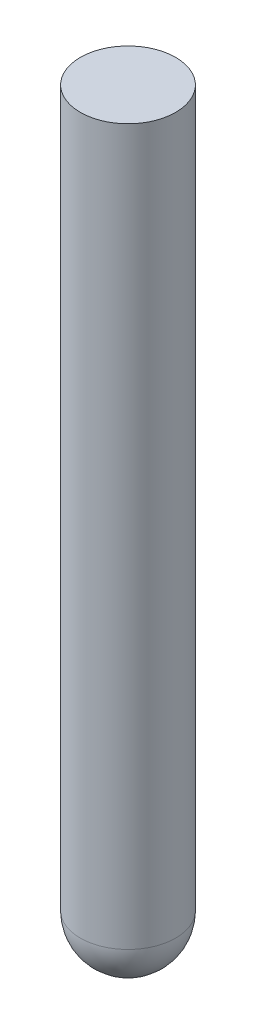
ISO-10303-21;
HEADER;
FILE_DESCRIPTION(('STEP AP214'),'2;1');
FILE_NAME('part.step','',(''),(''),'','','');
FILE_SCHEMA(('AUTOMOTIVE_DESIGN { 1 0 10303 214 1 1 1 1 }'));
ENDSEC;
DATA;
#1=APPLICATION_CONTEXT('core data for automotive mechanical design processes');
#2=APPLICATION_PROTOCOL_DEFINITION('international standard','automotive_design',2000,#1);
#3=PRODUCT_CONTEXT('',#1,'mechanical');
#4=PRODUCT('Part','Part','',(#3));
#5=PRODUCT_RELATED_PRODUCT_CATEGORY('part','',(#4));
#6=PRODUCT_DEFINITION_FORMATION('','',#4);
#7=PRODUCT_DEFINITION_CONTEXT('part definition',#1,'design');
#8=PRODUCT_DEFINITION('design','',#6,#7);
#9=PRODUCT_DEFINITION_SHAPE('','',#8);
#10=(LENGTH_UNIT() NAMED_UNIT(*) SI_UNIT(.MILLI.,.METRE.));
#11=(NAMED_UNIT(*) PLANE_ANGLE_UNIT() SI_UNIT($,.RADIAN.));
#12=(NAMED_UNIT(*) SI_UNIT($,.STERADIAN.) SOLID_ANGLE_UNIT());
#13=UNCERTAINTY_MEASURE_WITH_UNIT(LENGTH_MEASURE(1.E-05),#10,'distance_accuracy_value','');
#14=(GEOMETRIC_REPRESENTATION_CONTEXT(3) GLOBAL_UNCERTAINTY_ASSIGNED_CONTEXT((#13)) GLOBAL_UNIT_ASSIGNED_CONTEXT((#10,
#11,#12)) REPRESENTATION_CONTEXT('',''));
#15=CARTESIAN_POINT('',(0.,0.,0.));
#16=DIRECTION('',(0.,0.,1.));
#17=DIRECTION('',(1.,0.,0.));
#18=AXIS2_PLACEMENT_3D('',#15,#16,#17);
#19=CARTESIAN_POINT('',(0.,50.8,0.));
#20=DIRECTION('',(0.,-1.,0.));
#21=DIRECTION('',(0.,0.,-1.));
#22=AXIS2_PLACEMENT_3D('',#19,#20,#21);
#23=CYLINDRICAL_SURFACE('',#22,3.175);
#24=CARTESIAN_POINT('',(0.,3.175,0.));
#25=DIRECTION('',(0.,-1.,0.));
#26=DIRECTION('',(0.,0.,-1.));
#27=AXIS2_PLACEMENT_3D('',#24,#25,#26);
#28=CIRCLE('',#27,3.175);
#29=CARTESIAN_POINT('',(0.,3.175,-3.175));
#30=VERTEX_POINT('',#29);
#31=EDGE_CURVE('E10',#30,#30,#28,.F.);
#32=ORIENTED_EDGE('',*,*,#31,.T.);
#33=EDGE_LOOP('',(#32));
#34=FACE_BOUND('',#33,.T.);
#35=CARTESIAN_POINT('',(0.,50.8,0.));
#36=DIRECTION('',(0.,1.,0.));
#37=DIRECTION('',(0.,0.,1.));
#38=AXIS2_PLACEMENT_3D('',#35,#36,#37);
#39=CIRCLE('',#38,3.175);
#40=CARTESIAN_POINT('',(0.,50.8,3.175));
#41=VERTEX_POINT('',#40);
#42=EDGE_CURVE('E38',#41,#41,#39,.T.);
#43=ORIENTED_EDGE('',*,*,#42,.F.);
#44=EDGE_LOOP('',(#43));
#45=FACE_BOUND('',#44,.T.);
#46=ADVANCED_FACE('F31',(#34,#45),#23,.T.);
#47=CARTESIAN_POINT('',(0.,50.8,0.));
#48=DIRECTION('',(0.,1.,0.));
#49=DIRECTION('',(0.,0.,1.));
#50=AXIS2_PLACEMENT_3D('',#47,#48,#49);
#51=PLANE('',#50);
#52=ORIENTED_EDGE('',*,*,#42,.T.);
#53=EDGE_LOOP('',(#52));
#54=FACE_BOUND('',#53,.T.);
#55=ADVANCED_FACE('F44',(#54),#51,.T.);
#56=CARTESIAN_POINT('',(0.,3.175,0.));
#57=DIRECTION('',(0.,1.,0.));
#58=DIRECTION('',(0.,0.,1.));
#59=AXIS2_PLACEMENT_3D('',#56,#57,#58);
#60=SPHERICAL_SURFACE('',#59,3.175);
#61=ORIENTED_EDGE('',*,*,#31,.F.);
#62=EDGE_LOOP('',(#61));
#63=FACE_BOUND('',#62,.T.);
#64=ADVANCED_FACE('F33',(#63),#60,.T.);
#65=CLOSED_SHELL('',(#46,#55,#64));
#66=MANIFOLD_SOLID_BREP('B2',#65);
#67=ADVANCED_BREP_SHAPE_REPRESENTATION('',(#18,#66),#14);
#68=SHAPE_DEFINITION_REPRESENTATION(#9,#67);
ENDSEC;
END-ISO-10303-21;
